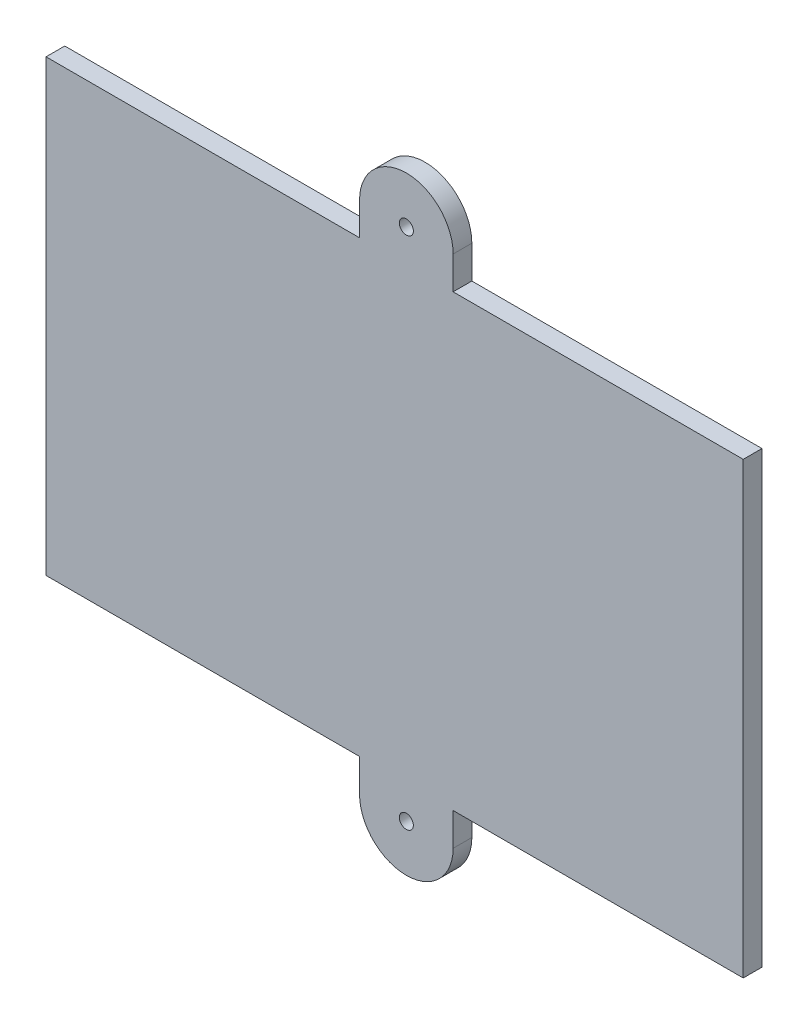
ISO-10303-21;
HEADER;
FILE_DESCRIPTION(('STEP AP214'),'2;1');
FILE_NAME('part.step','',(''),(''),'','','');
FILE_SCHEMA(('AUTOMOTIVE_DESIGN { 1 0 10303 214 1 1 1 1 }'));
ENDSEC;
DATA;
#1=APPLICATION_CONTEXT('core data for automotive mechanical design processes');
#2=APPLICATION_PROTOCOL_DEFINITION('international standard','automotive_design',2000,#1);
#3=PRODUCT_CONTEXT('',#1,'mechanical');
#4=PRODUCT('Part','Part','',(#3));
#5=PRODUCT_RELATED_PRODUCT_CATEGORY('part','',(#4));
#6=PRODUCT_DEFINITION_FORMATION('','',#4);
#7=PRODUCT_DEFINITION_CONTEXT('part definition',#1,'design');
#8=PRODUCT_DEFINITION('design','',#6,#7);
#9=PRODUCT_DEFINITION_SHAPE('','',#8);
#10=(LENGTH_UNIT() NAMED_UNIT(*) SI_UNIT(.MILLI.,.METRE.));
#11=(NAMED_UNIT(*) PLANE_ANGLE_UNIT() SI_UNIT($,.RADIAN.));
#12=(NAMED_UNIT(*) SI_UNIT($,.STERADIAN.) SOLID_ANGLE_UNIT());
#13=UNCERTAINTY_MEASURE_WITH_UNIT(LENGTH_MEASURE(1.E-05),#10,'distance_accuracy_value','');
#14=(GEOMETRIC_REPRESENTATION_CONTEXT(3) GLOBAL_UNCERTAINTY_ASSIGNED_CONTEXT((#13)) GLOBAL_UNIT_ASSIGNED_CONTEXT((#10,
#11,#12)) REPRESENTATION_CONTEXT('',''));
#15=CARTESIAN_POINT('',(0.,0.,0.));
#16=DIRECTION('',(0.,0.,1.));
#17=DIRECTION('',(1.,0.,0.));
#18=AXIS2_PLACEMENT_3D('',#15,#16,#17);
#19=CARTESIAN_POINT('',(0.,0.,4.));
#20=DIRECTION('',(1.,0.,0.));
#21=DIRECTION('',(0.,0.,-1.));
#22=AXIS2_PLACEMENT_3D('',#19,#20,#21);
#23=PLANE('',#22);
#24=DIRECTION('',(0.,-1.,0.));
#25=VECTOR('',#24,1.);
#26=CARTESIAN_POINT('',(0.,0.,0.));
#27=LINE('',#26,#25);
#28=CARTESIAN_POINT('',(0.,0.,0.));
#29=VERTEX_POINT('',#28);
#30=CARTESIAN_POINT('',(0.,-96.,0.));
#31=VERTEX_POINT('',#30);
#32=EDGE_CURVE('E168',#29,#31,#27,.T.);
#33=ORIENTED_EDGE('',*,*,#32,.T.);
#34=DIRECTION('',(0.,0.,-1.));
#35=VECTOR('',#34,1.);
#36=CARTESIAN_POINT('',(0.,-96.,4.));
#37=LINE('',#36,#35);
#38=CARTESIAN_POINT('',(0.,-96.,4.));
#39=VERTEX_POINT('',#38);
#40=EDGE_CURVE('E11',#39,#31,#37,.T.);
#41=ORIENTED_EDGE('',*,*,#40,.F.);
#42=DIRECTION('',(0.,-1.,0.));
#43=VECTOR('',#42,1.);
#44=CARTESIAN_POINT('',(0.,0.,4.));
#45=LINE('',#44,#43);
#46=CARTESIAN_POINT('',(0.,0.,4.));
#47=VERTEX_POINT('',#46);
#48=EDGE_CURVE('E245',#47,#39,#45,.T.);
#49=ORIENTED_EDGE('',*,*,#48,.F.);
#50=DIRECTION('',(0.,0.,-1.));
#51=VECTOR('',#50,1.);
#52=CARTESIAN_POINT('',(0.,0.,4.));
#53=LINE('',#52,#51);
#54=EDGE_CURVE('E56',#47,#29,#53,.T.);
#55=ORIENTED_EDGE('',*,*,#54,.T.);
#56=EDGE_LOOP('',(#33,#41,#49,#55));
#57=FACE_BOUND('',#56,.T.);
#58=ADVANCED_FACE('F39',(#57),#23,.F.);
#59=CARTESIAN_POINT('',(0.,-96.,4.));
#60=DIRECTION('',(0.,1.,0.));
#61=DIRECTION('',(0.,0.,1.));
#62=AXIS2_PLACEMENT_3D('',#59,#60,#61);
#63=PLANE('',#62);
#64=DIRECTION('',(1.,0.,0.));
#65=VECTOR('',#64,1.);
#66=CARTESIAN_POINT('',(0.,-96.,0.));
#67=LINE('',#66,#65);
#68=CARTESIAN_POINT('',(67.,-96.,0.));
#69=VERTEX_POINT('',#68);
#70=EDGE_CURVE('E170',#31,#69,#67,.T.);
#71=ORIENTED_EDGE('',*,*,#70,.T.);
#72=DIRECTION('',(0.,0.,-1.));
#73=VECTOR('',#72,1.);
#74=CARTESIAN_POINT('',(67.,-96.,4.));
#75=LINE('',#74,#73);
#76=CARTESIAN_POINT('',(67.,-96.,4.));
#77=VERTEX_POINT('',#76);
#78=EDGE_CURVE('E48',#77,#69,#75,.T.);
#79=ORIENTED_EDGE('',*,*,#78,.F.);
#80=DIRECTION('',(1.,0.,0.));
#81=VECTOR('',#80,1.);
#82=CARTESIAN_POINT('',(0.,-96.,4.));
#83=LINE('',#82,#81);
#84=EDGE_CURVE('E107',#39,#77,#83,.T.);
#85=ORIENTED_EDGE('',*,*,#84,.F.);
#86=ORIENTED_EDGE('',*,*,#40,.T.);
#87=EDGE_LOOP('',(#71,#79,#85,#86));
#88=FACE_BOUND('',#87,.T.);
#89=ADVANCED_FACE('F216',(#88),#63,.F.);
#90=CARTESIAN_POINT('',(66.9999999999998,1.32830254731938E-13,4.));
#91=DIRECTION('',(-1.,0.,0.));
#92=DIRECTION('',(0.,-1.,0.));
#93=AXIS2_PLACEMENT_3D('',#90,#91,#92);
#94=PLANE('',#93);
#95=DIRECTION('',(0.,1.,0.));
#96=VECTOR('',#95,1.);
#97=CARTESIAN_POINT('',(66.9999999999998,1.32830254731938E-13,0.));
#98=LINE('',#97,#96);
#99=CARTESIAN_POINT('',(67.,-103.,0.));
#100=VERTEX_POINT('',#99);
#101=EDGE_CURVE('E173',#100,#69,#98,.T.);
#102=ORIENTED_EDGE('',*,*,#101,.F.);
#103=DIRECTION('',(0.,0.,-1.));
#104=VECTOR('',#103,1.);
#105=CARTESIAN_POINT('',(67.,-103.,4.));
#106=LINE('',#105,#104);
#107=CARTESIAN_POINT('',(67.,-103.,4.));
#108=VERTEX_POINT('',#107);
#109=EDGE_CURVE('E209',#108,#100,#106,.T.);
#110=ORIENTED_EDGE('',*,*,#109,.F.);
#111=DIRECTION('',(0.,1.,0.));
#112=VECTOR('',#111,1.);
#113=CARTESIAN_POINT('',(66.9999999999998,1.32830254731938E-13,4.));
#114=LINE('',#113,#112);
#115=EDGE_CURVE('E215',#108,#77,#114,.T.);
#116=ORIENTED_EDGE('',*,*,#115,.T.);
#117=ORIENTED_EDGE('',*,*,#78,.T.);
#118=EDGE_LOOP('',(#102,#110,#116,#117));
#119=FACE_BOUND('',#118,.T.);
#120=ADVANCED_FACE('F213',(#119),#94,.T.);
#121=CARTESIAN_POINT('',(77.,-103.,4.));
#122=DIRECTION('',(0.,0.,-1.));
#123=DIRECTION('',(-1.,0.,0.));
#124=AXIS2_PLACEMENT_3D('',#121,#122,#123);
#125=CYLINDRICAL_SURFACE('',#124,9.99999999999997);
#126=CARTESIAN_POINT('',(77.,-103.,0.));
#127=DIRECTION('',(0.,0.,1.));
#128=DIRECTION('',(1.,0.,0.));
#129=AXIS2_PLACEMENT_3D('',#126,#127,#128);
#130=CIRCLE('',#129,9.99999999999997);
#131=CARTESIAN_POINT('',(87.,-103.,0.));
#132=VERTEX_POINT('',#131);
#133=EDGE_CURVE('E177',#100,#132,#130,.T.);
#134=ORIENTED_EDGE('',*,*,#133,.T.);
#135=DIRECTION('',(0.,0.,-1.));
#136=VECTOR('',#135,1.);
#137=CARTESIAN_POINT('',(87.,-103.,4.));
#138=LINE('',#137,#136);
#139=CARTESIAN_POINT('',(87.,-103.,4.));
#140=VERTEX_POINT('',#139);
#141=EDGE_CURVE('E206',#140,#132,#138,.T.);
#142=ORIENTED_EDGE('',*,*,#141,.F.);
#143=CARTESIAN_POINT('',(77.,-103.,4.));
#144=DIRECTION('',(0.,0.,1.));
#145=DIRECTION('',(1.,0.,0.));
#146=AXIS2_PLACEMENT_3D('',#143,#144,#145);
#147=CIRCLE('',#146,9.99999999999997);
#148=EDGE_CURVE('E234',#108,#140,#147,.T.);
#149=ORIENTED_EDGE('',*,*,#148,.F.);
#150=ORIENTED_EDGE('',*,*,#109,.T.);
#151=EDGE_LOOP('',(#134,#142,#149,#150));
#152=FACE_BOUND('',#151,.T.);
#153=ADVANCED_FACE('F225',(#152),#125,.T.);
#154=CARTESIAN_POINT('',(87.0000000000002,-1.72481077039981E-13,4.));
#155=DIRECTION('',(-1.,0.,0.));
#156=DIRECTION('',(0.,-1.,0.));
#157=AXIS2_PLACEMENT_3D('',#154,#155,#156);
#158=PLANE('',#157);
#159=DIRECTION('',(0.,1.,0.));
#160=VECTOR('',#159,1.);
#161=CARTESIAN_POINT('',(87.0000000000002,-1.72481077039981E-13,0.));
#162=LINE('',#161,#160);
#163=CARTESIAN_POINT('',(87.,-96.,0.));
#164=VERTEX_POINT('',#163);
#165=EDGE_CURVE('E179',#132,#164,#162,.T.);
#166=ORIENTED_EDGE('',*,*,#165,.T.);
#167=DIRECTION('',(0.,0.,-1.));
#168=VECTOR('',#167,1.);
#169=CARTESIAN_POINT('',(87.,-96.,4.));
#170=LINE('',#169,#168);
#171=CARTESIAN_POINT('',(87.,-96.,4.));
#172=VERTEX_POINT('',#171);
#173=EDGE_CURVE('E203',#172,#164,#170,.T.);
#174=ORIENTED_EDGE('',*,*,#173,.F.);
#175=DIRECTION('',(0.,1.,0.));
#176=VECTOR('',#175,1.);
#177=CARTESIAN_POINT('',(87.0000000000002,-1.72481077039981E-13,4.));
#178=LINE('',#177,#176);
#179=EDGE_CURVE('E231',#140,#172,#178,.T.);
#180=ORIENTED_EDGE('',*,*,#179,.F.);
#181=ORIENTED_EDGE('',*,*,#141,.T.);
#182=EDGE_LOOP('',(#166,#174,#180,#181));
#183=FACE_BOUND('',#182,.T.);
#184=ADVANCED_FACE('F229',(#183),#158,.F.);
#185=CARTESIAN_POINT('',(149.,-96.,0.));
#186=VERTEX_POINT('',#185);
#187=EDGE_CURVE('E174',#164,#186,#67,.T.);
#188=ORIENTED_EDGE('',*,*,#187,.T.);
#189=DIRECTION('',(0.,0.,-1.));
#190=VECTOR('',#189,1.);
#191=CARTESIAN_POINT('',(149.,-96.,4.));
#192=LINE('',#191,#190);
#193=CARTESIAN_POINT('',(149.,-96.,4.));
#194=VERTEX_POINT('',#193);
#195=EDGE_CURVE('E201',#194,#186,#192,.T.);
#196=ORIENTED_EDGE('',*,*,#195,.F.);
#197=EDGE_CURVE('E233',#172,#194,#83,.T.);
#198=ORIENTED_EDGE('',*,*,#197,.F.);
#199=ORIENTED_EDGE('',*,*,#173,.T.);
#200=EDGE_LOOP('',(#188,#196,#198,#199));
#201=FACE_BOUND('',#200,.T.);
#202=ADVANCED_FACE('F277',(#201),#63,.F.);
#203=CARTESIAN_POINT('',(149.,0.,4.));
#204=DIRECTION('',(1.,0.,0.));
#205=DIRECTION('',(0.,0.,-1.));
#206=AXIS2_PLACEMENT_3D('',#203,#204,#205);
#207=PLANE('',#206);
#208=DIRECTION('',(0.,-1.,0.));
#209=VECTOR('',#208,1.);
#210=CARTESIAN_POINT('',(149.,0.,0.));
#211=LINE('',#210,#209);
#212=CARTESIAN_POINT('',(149.,0.,0.));
#213=VERTEX_POINT('',#212);
#214=EDGE_CURVE('E181',#213,#186,#211,.T.);
#215=ORIENTED_EDGE('',*,*,#214,.F.);
#216=DIRECTION('',(0.,0.,-1.));
#217=VECTOR('',#216,1.);
#218=CARTESIAN_POINT('',(149.,0.,4.));
#219=LINE('',#218,#217);
#220=CARTESIAN_POINT('',(149.,0.,4.));
#221=VERTEX_POINT('',#220);
#222=EDGE_CURVE('E199',#221,#213,#219,.T.);
#223=ORIENTED_EDGE('',*,*,#222,.F.);
#224=DIRECTION('',(0.,-1.,0.));
#225=VECTOR('',#224,1.);
#226=CARTESIAN_POINT('',(149.,0.,4.));
#227=LINE('',#226,#225);
#228=EDGE_CURVE('E236',#221,#194,#227,.T.);
#229=ORIENTED_EDGE('',*,*,#228,.T.);
#230=ORIENTED_EDGE('',*,*,#195,.T.);
#231=EDGE_LOOP('',(#215,#223,#229,#230));
#232=FACE_BOUND('',#231,.T.);
#233=ADVANCED_FACE('F296',(#232),#207,.T.);
#234=CARTESIAN_POINT('',(0.,0.,4.));
#235=DIRECTION('',(0.,1.,0.));
#236=DIRECTION('',(0.,0.,1.));
#237=AXIS2_PLACEMENT_3D('',#234,#235,#236);
#238=PLANE('',#237);
#239=DIRECTION('',(1.,0.,0.));
#240=VECTOR('',#239,1.);
#241=CARTESIAN_POINT('',(0.,0.,0.));
#242=LINE('',#241,#240);
#243=CARTESIAN_POINT('',(87.,0.,0.));
#244=VERTEX_POINT('',#243);
#245=EDGE_CURVE('E184',#244,#213,#242,.T.);
#246=ORIENTED_EDGE('',*,*,#245,.F.);
#247=DIRECTION('',(0.,0.,-1.));
#248=VECTOR('',#247,1.);
#249=CARTESIAN_POINT('',(87.,0.,4.));
#250=LINE('',#249,#248);
#251=CARTESIAN_POINT('',(87.,0.,4.));
#252=VERTEX_POINT('',#251);
#253=EDGE_CURVE('E197',#252,#244,#250,.T.);
#254=ORIENTED_EDGE('',*,*,#253,.F.);
#255=DIRECTION('',(1.,0.,0.));
#256=VECTOR('',#255,1.);
#257=CARTESIAN_POINT('',(0.,0.,4.));
#258=LINE('',#257,#256);
#259=EDGE_CURVE('E158',#252,#221,#258,.T.);
#260=ORIENTED_EDGE('',*,*,#259,.T.);
#261=ORIENTED_EDGE('',*,*,#222,.T.);
#262=EDGE_LOOP('',(#246,#254,#260,#261));
#263=FACE_BOUND('',#262,.T.);
#264=ADVANCED_FACE('F270',(#263),#238,.T.);
#265=CARTESIAN_POINT('',(87.,1.7248107703998E-13,4.));
#266=DIRECTION('',(1.,0.,0.));
#267=DIRECTION('',(0.,1.,0.));
#268=AXIS2_PLACEMENT_3D('',#265,#266,#267);
#269=PLANE('',#268);
#270=DIRECTION('',(0.,-1.,0.));
#271=VECTOR('',#270,1.);
#272=CARTESIAN_POINT('',(87.,1.7248107703998E-13,0.));
#273=LINE('',#272,#271);
#274=CARTESIAN_POINT('',(87.,7.,0.));
#275=VERTEX_POINT('',#274);
#276=EDGE_CURVE('E187',#275,#244,#273,.T.);
#277=ORIENTED_EDGE('',*,*,#276,.F.);
#278=DIRECTION('',(0.,0.,-1.));
#279=VECTOR('',#278,1.);
#280=CARTESIAN_POINT('',(87.,7.,4.));
#281=LINE('',#280,#279);
#282=CARTESIAN_POINT('',(87.,7.,4.));
#283=VERTEX_POINT('',#282);
#284=EDGE_CURVE('E144',#283,#275,#281,.T.);
#285=ORIENTED_EDGE('',*,*,#284,.F.);
#286=DIRECTION('',(0.,-1.,0.));
#287=VECTOR('',#286,1.);
#288=CARTESIAN_POINT('',(87.,1.7248107703998E-13,4.));
#289=LINE('',#288,#287);
#290=EDGE_CURVE('E156',#283,#252,#289,.T.);
#291=ORIENTED_EDGE('',*,*,#290,.T.);
#292=ORIENTED_EDGE('',*,*,#253,.T.);
#293=EDGE_LOOP('',(#277,#285,#291,#292));
#294=FACE_BOUND('',#293,.T.);
#295=ADVANCED_FACE('F290',(#294),#269,.T.);
#296=CARTESIAN_POINT('',(77.,7.,4.));
#297=DIRECTION('',(0.,0.,-1.));
#298=DIRECTION('',(-1.,0.,0.));
#299=AXIS2_PLACEMENT_3D('',#296,#297,#298);
#300=CYLINDRICAL_SURFACE('',#299,10.);
#301=CARTESIAN_POINT('',(77.,7.,0.));
#302=DIRECTION('',(0.,0.,1.));
#303=DIRECTION('',(1.,0.,0.));
#304=AXIS2_PLACEMENT_3D('',#301,#302,#303);
#305=CIRCLE('',#304,10.);
#306=CARTESIAN_POINT('',(67.,7.,0.));
#307=VERTEX_POINT('',#306);
#308=EDGE_CURVE('E141',#307,#275,#305,.F.);
#309=ORIENTED_EDGE('',*,*,#308,.F.);
#310=DIRECTION('',(0.,0.,-1.));
#311=VECTOR('',#310,1.);
#312=CARTESIAN_POINT('',(67.,7.,4.));
#313=LINE('',#312,#311);
#314=CARTESIAN_POINT('',(67.,7.,4.));
#315=VERTEX_POINT('',#314);
#316=EDGE_CURVE('E135',#315,#307,#313,.T.);
#317=ORIENTED_EDGE('',*,*,#316,.F.);
#318=CARTESIAN_POINT('',(77.,7.,4.));
#319=DIRECTION('',(0.,0.,1.));
#320=DIRECTION('',(1.,0.,0.));
#321=AXIS2_PLACEMENT_3D('',#318,#319,#320);
#322=CIRCLE('',#321,10.);
#323=EDGE_CURVE('E139',#315,#283,#322,.F.);
#324=ORIENTED_EDGE('',*,*,#323,.T.);
#325=ORIENTED_EDGE('',*,*,#284,.T.);
#326=EDGE_LOOP('',(#309,#317,#324,#325));
#327=FACE_BOUND('',#326,.T.);
#328=ADVANCED_FACE('F137',(#327),#300,.T.);
#329=CARTESIAN_POINT('',(67.,0.,4.));
#330=DIRECTION('',(1.,0.,0.));
#331=DIRECTION('',(0.,0.,-1.));
#332=AXIS2_PLACEMENT_3D('',#329,#330,#331);
#333=PLANE('',#332);
#334=DIRECTION('',(0.,-1.,0.));
#335=VECTOR('',#334,1.);
#336=CARTESIAN_POINT('',(67.,0.,0.));
#337=LINE('',#336,#335);
#338=CARTESIAN_POINT('',(67.,0.,0.));
#339=VERTEX_POINT('',#338);
#340=EDGE_CURVE('E192',#307,#339,#337,.T.);
#341=ORIENTED_EDGE('',*,*,#340,.T.);
#342=DIRECTION('',(0.,0.,-1.));
#343=VECTOR('',#342,1.);
#344=CARTESIAN_POINT('',(67.,0.,4.));
#345=LINE('',#344,#343);
#346=CARTESIAN_POINT('',(67.,0.,4.));
#347=VERTEX_POINT('',#346);
#348=EDGE_CURVE('E95',#347,#339,#345,.T.);
#349=ORIENTED_EDGE('',*,*,#348,.F.);
#350=DIRECTION('',(0.,-1.,0.));
#351=VECTOR('',#350,1.);
#352=CARTESIAN_POINT('',(67.,0.,4.));
#353=LINE('',#352,#351);
#354=EDGE_CURVE('E146',#315,#347,#353,.T.);
#355=ORIENTED_EDGE('',*,*,#354,.F.);
#356=ORIENTED_EDGE('',*,*,#316,.T.);
#357=EDGE_LOOP('',(#341,#349,#355,#356));
#358=FACE_BOUND('',#357,.T.);
#359=ADVANCED_FACE('F147',(#358),#333,.F.);
#360=CARTESIAN_POINT('',(77.,7.,4.));
#361=DIRECTION('',(0.,0.,-1.));
#362=DIRECTION('',(-1.,0.,0.));
#363=AXIS2_PLACEMENT_3D('',#360,#361,#362);
#364=CYLINDRICAL_SURFACE('',#363,1.5);
#365=CARTESIAN_POINT('',(77.,7.,4.));
#366=DIRECTION('',(0.,0.,1.));
#367=DIRECTION('',(1.,0.,0.));
#368=AXIS2_PLACEMENT_3D('',#365,#366,#367);
#369=CIRCLE('',#368,1.5);
#370=CARTESIAN_POINT('',(78.5,7.,4.));
#371=VERTEX_POINT('',#370);
#372=EDGE_CURVE('E246',#371,#371,#369,.T.);
#373=ORIENTED_EDGE('',*,*,#372,.T.);
#374=EDGE_LOOP('',(#373));
#375=FACE_BOUND('',#374,.T.);
#376=CARTESIAN_POINT('',(77.,7.,0.));
#377=DIRECTION('',(0.,0.,1.));
#378=DIRECTION('',(1.,0.,0.));
#379=AXIS2_PLACEMENT_3D('',#376,#377,#378);
#380=CIRCLE('',#379,1.5);
#381=CARTESIAN_POINT('',(78.5,7.,0.));
#382=VERTEX_POINT('',#381);
#383=EDGE_CURVE('E165',#382,#382,#380,.T.);
#384=ORIENTED_EDGE('',*,*,#383,.F.);
#385=EDGE_LOOP('',(#384));
#386=FACE_BOUND('',#385,.T.);
#387=ADVANCED_FACE('F258',(#375,#386),#364,.F.);
#388=CARTESIAN_POINT('',(77.,-103.,4.));
#389=DIRECTION('',(0.,0.,-1.));
#390=DIRECTION('',(-1.,0.,0.));
#391=AXIS2_PLACEMENT_3D('',#388,#389,#390);
#392=CYLINDRICAL_SURFACE('',#391,1.5);
#393=CARTESIAN_POINT('',(77.,-103.,4.));
#394=DIRECTION('',(0.,0.,1.));
#395=DIRECTION('',(1.,0.,0.));
#396=AXIS2_PLACEMENT_3D('',#393,#394,#395);
#397=CIRCLE('',#396,1.5);
#398=CARTESIAN_POINT('',(78.5,-103.,4.));
#399=VERTEX_POINT('',#398);
#400=EDGE_CURVE('E249',#399,#399,#397,.F.);
#401=ORIENTED_EDGE('',*,*,#400,.F.);
#402=EDGE_LOOP('',(#401));
#403=FACE_BOUND('',#402,.T.);
#404=CARTESIAN_POINT('',(77.,-103.,0.));
#405=DIRECTION('',(0.,0.,1.));
#406=DIRECTION('',(1.,0.,0.));
#407=AXIS2_PLACEMENT_3D('',#404,#405,#406);
#408=CIRCLE('',#407,1.5);
#409=CARTESIAN_POINT('',(78.5,-103.,0.));
#410=VERTEX_POINT('',#409);
#411=EDGE_CURVE('E162',#410,#410,#408,.F.);
#412=ORIENTED_EDGE('',*,*,#411,.T.);
#413=EDGE_LOOP('',(#412));
#414=FACE_BOUND('',#413,.T.);
#415=ADVANCED_FACE('F41',(#403,#414),#392,.F.);
#416=EDGE_CURVE('E188',#29,#339,#242,.T.);
#417=ORIENTED_EDGE('',*,*,#416,.F.);
#418=ORIENTED_EDGE('',*,*,#54,.F.);
#419=EDGE_CURVE('E150',#47,#347,#258,.T.);
#420=ORIENTED_EDGE('',*,*,#419,.T.);
#421=ORIENTED_EDGE('',*,*,#348,.T.);
#422=EDGE_LOOP('',(#417,#418,#420,#421));
#423=FACE_BOUND('',#422,.T.);
#424=ADVANCED_FACE('F244',(#423),#238,.T.);
#425=CARTESIAN_POINT('',(0.,0.,4.));
#426=DIRECTION('',(0.,0.,1.));
#427=DIRECTION('',(1.,0.,0.));
#428=AXIS2_PLACEMENT_3D('',#425,#426,#427);
#429=PLANE('',#428);
#430=ORIENTED_EDGE('',*,*,#400,.T.);
#431=EDGE_LOOP('',(#430));
#432=FACE_BOUND('',#431,.T.);
#433=ORIENTED_EDGE('',*,*,#372,.F.);
#434=EDGE_LOOP('',(#433));
#435=FACE_BOUND('',#434,.T.);
#436=ORIENTED_EDGE('',*,*,#48,.T.);
#437=ORIENTED_EDGE('',*,*,#84,.T.);
#438=ORIENTED_EDGE('',*,*,#115,.F.);
#439=ORIENTED_EDGE('',*,*,#148,.T.);
#440=ORIENTED_EDGE('',*,*,#179,.T.);
#441=ORIENTED_EDGE('',*,*,#197,.T.);
#442=ORIENTED_EDGE('',*,*,#228,.F.);
#443=ORIENTED_EDGE('',*,*,#259,.F.);
#444=ORIENTED_EDGE('',*,*,#290,.F.);
#445=ORIENTED_EDGE('',*,*,#323,.F.);
#446=ORIENTED_EDGE('',*,*,#354,.T.);
#447=ORIENTED_EDGE('',*,*,#419,.F.);
#448=EDGE_LOOP('',(#436,#437,#438,#439,#440,#441,#442,#443,#444,#445,#446,#447));
#449=FACE_BOUND('',#448,.T.);
#450=ADVANCED_FACE('F153',(#432,#435,#449),#429,.T.);
#451=CARTESIAN_POINT('',(0.,0.,0.));
#452=DIRECTION('',(0.,0.,1.));
#453=DIRECTION('',(1.,0.,0.));
#454=AXIS2_PLACEMENT_3D('',#451,#452,#453);
#455=PLANE('',#454);
#456=ORIENTED_EDGE('',*,*,#411,.F.);
#457=EDGE_LOOP('',(#456));
#458=FACE_BOUND('',#457,.T.);
#459=ORIENTED_EDGE('',*,*,#383,.T.);
#460=EDGE_LOOP('',(#459));
#461=FACE_BOUND('',#460,.T.);
#462=ORIENTED_EDGE('',*,*,#32,.F.);
#463=ORIENTED_EDGE('',*,*,#416,.T.);
#464=ORIENTED_EDGE('',*,*,#340,.F.);
#465=ORIENTED_EDGE('',*,*,#308,.T.);
#466=ORIENTED_EDGE('',*,*,#276,.T.);
#467=ORIENTED_EDGE('',*,*,#245,.T.);
#468=ORIENTED_EDGE('',*,*,#214,.T.);
#469=ORIENTED_EDGE('',*,*,#187,.F.);
#470=ORIENTED_EDGE('',*,*,#165,.F.);
#471=ORIENTED_EDGE('',*,*,#133,.F.);
#472=ORIENTED_EDGE('',*,*,#101,.T.);
#473=ORIENTED_EDGE('',*,*,#70,.F.);
#474=EDGE_LOOP('',(#462,#463,#464,#465,#466,#467,#468,#469,#470,#471,#472,#473));
#475=FACE_BOUND('',#474,.T.);
#476=ADVANCED_FACE('F220',(#458,#461,#475),#455,.F.);
#477=CLOSED_SHELL('',(#58,#89,#120,#153,#184,#202,#233,#264,#295,#328,#359,#387,#415,#424,#450,#476));
#478=MANIFOLD_SOLID_BREP('B2',#477);
#479=ADVANCED_BREP_SHAPE_REPRESENTATION('',(#18,#478),#14);
#480=SHAPE_DEFINITION_REPRESENTATION(#9,#479);
ENDSEC;
END-ISO-10303-21;
